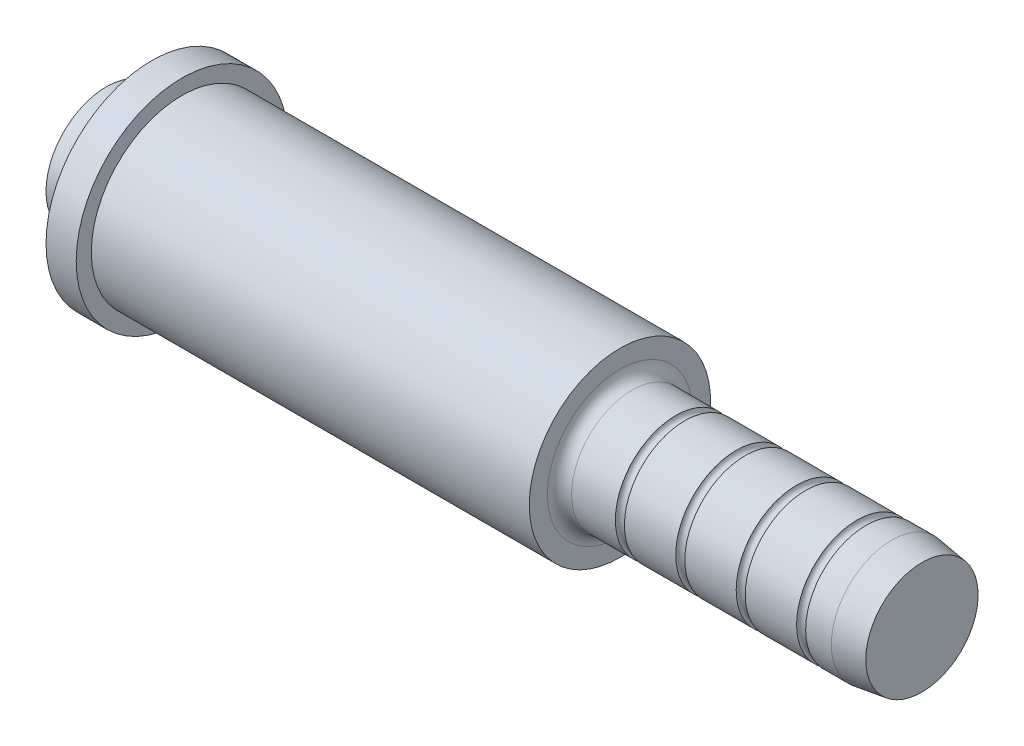
ISO-10303-21;
HEADER;
FILE_DESCRIPTION(('STEP AP214'),'2;1');
FILE_NAME('part.step','',(''),(''),'','','');
FILE_SCHEMA(('AUTOMOTIVE_DESIGN { 1 0 10303 214 1 1 1 1 }'));
ENDSEC;
DATA;
#1=APPLICATION_CONTEXT('core data for automotive mechanical design processes');
#2=APPLICATION_PROTOCOL_DEFINITION('international standard','automotive_design',2000,#1);
#3=PRODUCT_CONTEXT('',#1,'mechanical');
#4=PRODUCT('Part','Part','',(#3));
#5=PRODUCT_RELATED_PRODUCT_CATEGORY('part','',(#4));
#6=PRODUCT_DEFINITION_FORMATION('','',#4);
#7=PRODUCT_DEFINITION_CONTEXT('part definition',#1,'design');
#8=PRODUCT_DEFINITION('design','',#6,#7);
#9=PRODUCT_DEFINITION_SHAPE('','',#8);
#10=(LENGTH_UNIT() NAMED_UNIT(*) SI_UNIT(.MILLI.,.METRE.));
#11=(NAMED_UNIT(*) PLANE_ANGLE_UNIT() SI_UNIT($,.RADIAN.));
#12=(NAMED_UNIT(*) SI_UNIT($,.STERADIAN.) SOLID_ANGLE_UNIT());
#13=UNCERTAINTY_MEASURE_WITH_UNIT(LENGTH_MEASURE(1.E-05),#10,'distance_accuracy_value','');
#14=(GEOMETRIC_REPRESENTATION_CONTEXT(3) GLOBAL_UNCERTAINTY_ASSIGNED_CONTEXT((#13)) GLOBAL_UNIT_ASSIGNED_CONTEXT((#10,
#11,#12)) REPRESENTATION_CONTEXT('',''));
#15=CARTESIAN_POINT('',(0.,0.,0.));
#16=DIRECTION('',(0.,0.,1.));
#17=DIRECTION('',(1.,0.,0.));
#18=AXIS2_PLACEMENT_3D('',#15,#16,#17);
#19=CARTESIAN_POINT('',(0.,0.,0.));
#20=DIRECTION('',(1.,0.,0.));
#21=DIRECTION('',(0.,0.,-1.));
#22=AXIS2_PLACEMENT_3D('',#19,#20,#21);
#23=PLANE('',#22);
#24=CARTESIAN_POINT('',(0.,0.,0.));
#25=DIRECTION('',(-1.,0.,0.));
#26=DIRECTION('',(0.,0.,1.));
#27=AXIS2_PLACEMENT_3D('',#24,#25,#26);
#28=CIRCLE('',#27,20.);
#29=CARTESIAN_POINT('',(0.,0.,20.));
#30=VERTEX_POINT('',#29);
#31=EDGE_CURVE('E128',#30,#30,#28,.T.);
#32=ORIENTED_EDGE('',*,*,#31,.T.);
#33=EDGE_LOOP('',(#32));
#34=FACE_BOUND('',#33,.T.);
#35=ADVANCED_FACE('F33',(#34),#23,.F.);
#36=CARTESIAN_POINT('',(0.,0.,0.));
#37=DIRECTION('',(-1.,0.,0.));
#38=DIRECTION('',(0.,0.,1.));
#39=AXIS2_PLACEMENT_3D('',#36,#37,#38);
#40=CYLINDRICAL_SURFACE('',#39,20.);
#41=ORIENTED_EDGE('',*,*,#31,.F.);
#42=EDGE_LOOP('',(#41));
#43=FACE_BOUND('',#42,.T.);
#44=CARTESIAN_POINT('',(15.,0.,0.));
#45=DIRECTION('',(-1.,0.,0.));
#46=DIRECTION('',(0.,0.,1.));
#47=AXIS2_PLACEMENT_3D('',#44,#45,#46);
#48=CIRCLE('',#47,20.);
#49=CARTESIAN_POINT('',(15.,0.,20.));
#50=VERTEX_POINT('',#49);
#51=EDGE_CURVE('E130',#50,#50,#48,.T.);
#52=ORIENTED_EDGE('',*,*,#51,.T.);
#53=EDGE_LOOP('',(#52));
#54=FACE_BOUND('',#53,.T.);
#55=ADVANCED_FACE('F95',(#43,#54),#40,.T.);
#56=CARTESIAN_POINT('',(15.,20.,0.));
#57=DIRECTION('',(1.,0.,0.));
#58=DIRECTION('',(0.,0.,-1.));
#59=AXIS2_PLACEMENT_3D('',#56,#57,#58);
#60=PLANE('',#59);
#61=ORIENTED_EDGE('',*,*,#51,.F.);
#62=EDGE_LOOP('',(#61));
#63=FACE_BOUND('',#62,.T.);
#64=CARTESIAN_POINT('',(15.,0.,0.));
#65=DIRECTION('',(-1.,0.,0.));
#66=DIRECTION('',(0.,0.,1.));
#67=AXIS2_PLACEMENT_3D('',#64,#65,#66);
#68=CIRCLE('',#67,35.);
#69=CARTESIAN_POINT('',(15.,0.,35.));
#70=VERTEX_POINT('',#69);
#71=EDGE_CURVE('E135',#70,#70,#68,.T.);
#72=ORIENTED_EDGE('',*,*,#71,.T.);
#73=EDGE_LOOP('',(#72));
#74=FACE_BOUND('',#73,.T.);
#75=ADVANCED_FACE('F101',(#63,#74),#60,.F.);
#76=CARTESIAN_POINT('',(0.,0.,0.));
#77=DIRECTION('',(-1.,0.,0.));
#78=DIRECTION('',(0.,0.,1.));
#79=AXIS2_PLACEMENT_3D('',#76,#77,#78);
#80=CYLINDRICAL_SURFACE('',#79,35.);
#81=ORIENTED_EDGE('',*,*,#71,.F.);
#82=EDGE_LOOP('',(#81));
#83=FACE_BOUND('',#82,.T.);
#84=CARTESIAN_POINT('',(25.,0.,0.));
#85=DIRECTION('',(-1.,0.,0.));
#86=DIRECTION('',(0.,0.,1.));
#87=AXIS2_PLACEMENT_3D('',#84,#85,#86);
#88=CIRCLE('',#87,35.);
#89=CARTESIAN_POINT('',(25.,0.,35.));
#90=VERTEX_POINT('',#89);
#91=EDGE_CURVE('E138',#90,#90,#88,.T.);
#92=ORIENTED_EDGE('',*,*,#91,.T.);
#93=EDGE_LOOP('',(#92));
#94=FACE_BOUND('',#93,.T.);
#95=ADVANCED_FACE('F161',(#83,#94),#80,.T.);
#96=CARTESIAN_POINT('',(25.,35.,0.));
#97=DIRECTION('',(-1.,0.,0.));
#98=DIRECTION('',(0.,0.,1.));
#99=AXIS2_PLACEMENT_3D('',#96,#97,#98);
#100=PLANE('',#99);
#101=ORIENTED_EDGE('',*,*,#91,.F.);
#102=EDGE_LOOP('',(#101));
#103=FACE_BOUND('',#102,.T.);
#104=CARTESIAN_POINT('',(25.,0.,0.));
#105=DIRECTION('',(-1.,0.,0.));
#106=DIRECTION('',(0.,0.,1.));
#107=AXIS2_PLACEMENT_3D('',#104,#105,#106);
#108=CIRCLE('',#107,30.);
#109=CARTESIAN_POINT('',(25.,0.,30.));
#110=VERTEX_POINT('',#109);
#111=EDGE_CURVE('E141',#110,#110,#108,.T.);
#112=ORIENTED_EDGE('',*,*,#111,.T.);
#113=EDGE_LOOP('',(#112));
#114=FACE_BOUND('',#113,.T.);
#115=ADVANCED_FACE('F155',(#103,#114),#100,.F.);
#116=CARTESIAN_POINT('',(0.,0.,0.));
#117=DIRECTION('',(-1.,0.,0.));
#118=DIRECTION('',(0.,0.,1.));
#119=AXIS2_PLACEMENT_3D('',#116,#117,#118);
#120=CYLINDRICAL_SURFACE('',#119,30.);
#121=ORIENTED_EDGE('',*,*,#111,.F.);
#122=EDGE_LOOP('',(#121));
#123=FACE_BOUND('',#122,.T.);
#124=CARTESIAN_POINT('',(170.,0.,0.));
#125=DIRECTION('',(-1.,0.,0.));
#126=DIRECTION('',(0.,0.,1.));
#127=AXIS2_PLACEMENT_3D('',#124,#125,#126);
#128=CIRCLE('',#127,30.);
#129=CARTESIAN_POINT('',(170.,0.,30.));
#130=VERTEX_POINT('',#129);
#131=EDGE_CURVE('E57',#130,#130,#128,.T.);
#132=ORIENTED_EDGE('',*,*,#131,.T.);
#133=EDGE_LOOP('',(#132));
#134=FACE_BOUND('',#133,.T.);
#135=ADVANCED_FACE('F147',(#123,#134),#120,.T.);
#136=CARTESIAN_POINT('',(170.,30.,0.));
#137=DIRECTION('',(-1.,0.,0.));
#138=DIRECTION('',(0.,0.,1.));
#139=AXIS2_PLACEMENT_3D('',#136,#137,#138);
#140=PLANE('',#139);
#141=CARTESIAN_POINT('',(170.,0.,0.));
#142=DIRECTION('',(-1.,0.,0.));
#143=DIRECTION('',(0.,0.,1.));
#144=AXIS2_PLACEMENT_3D('',#141,#142,#143);
#145=CIRCLE('',#144,24.);
#146=CARTESIAN_POINT('',(170.,0.,24.));
#147=VERTEX_POINT('',#146);
#148=EDGE_CURVE('E126',#147,#147,#145,.T.);
#149=ORIENTED_EDGE('',*,*,#148,.T.);
#150=EDGE_LOOP('',(#149));
#151=FACE_BOUND('',#150,.T.);
#152=ORIENTED_EDGE('',*,*,#131,.F.);
#153=EDGE_LOOP('',(#152));
#154=FACE_BOUND('',#153,.T.);
#155=ADVANCED_FACE('F119',(#151,#154),#140,.F.);
#156=CARTESIAN_POINT('',(0.,0.,0.));
#157=DIRECTION('',(-1.,0.,0.));
#158=DIRECTION('',(0.,0.,1.));
#159=AXIS2_PLACEMENT_3D('',#156,#157,#158);
#160=CYLINDRICAL_SURFACE('',#159,20.);
#161=CARTESIAN_POINT('',(188.5,0.,0.));
#162=DIRECTION('',(1.,0.,0.));
#163=DIRECTION('',(0.,0.,-1.));
#164=AXIS2_PLACEMENT_3D('',#161,#162,#163);
#165=CIRCLE('',#164,20.);
#166=CARTESIAN_POINT('',(188.5,0.,-20.));
#167=VERTEX_POINT('',#166);
#168=EDGE_CURVE('E50',#167,#167,#165,.F.);
#169=ORIENTED_EDGE('',*,*,#168,.T.);
#170=EDGE_LOOP('',(#169));
#171=FACE_BOUND('',#170,.T.);
#172=CARTESIAN_POINT('',(174.,0.,0.));
#173=DIRECTION('',(-1.,0.,0.));
#174=DIRECTION('',(0.,0.,1.));
#175=AXIS2_PLACEMENT_3D('',#172,#173,#174);
#176=CIRCLE('',#175,20.);
#177=CARTESIAN_POINT('',(174.,0.,20.));
#178=VERTEX_POINT('',#177);
#179=EDGE_CURVE('E46',#178,#178,#176,.F.);
#180=ORIENTED_EDGE('',*,*,#179,.T.);
#181=EDGE_LOOP('',(#180));
#182=FACE_BOUND('',#181,.T.);
#183=ADVANCED_FACE('F109',(#171,#182),#160,.T.);
#184=CARTESIAN_POINT('',(174.,0.,0.));
#185=DIRECTION('',(-1.,0.,0.));
#186=DIRECTION('',(0.,0.,1.));
#187=AXIS2_PLACEMENT_3D('',#184,#185,#186);
#188=TOROIDAL_SURFACE('',#187,24.,4.);
#189=ORIENTED_EDGE('',*,*,#179,.F.);
#190=EDGE_LOOP('',(#189));
#191=FACE_BOUND('',#190,.T.);
#192=ORIENTED_EDGE('',*,*,#148,.F.);
#193=EDGE_LOOP('',(#192));
#194=FACE_BOUND('',#193,.T.);
#195=ADVANCED_FACE('F106',(#191,#194),#188,.F.);
#196=CARTESIAN_POINT('',(190.,0.,0.));
#197=DIRECTION('',(1.,0.,0.));
#198=DIRECTION('',(0.,0.,-1.));
#199=AXIS2_PLACEMENT_3D('',#196,#197,#198);
#200=TOROIDAL_SURFACE('',#199,20.,1.5);
#201=ORIENTED_EDGE('',*,*,#168,.F.);
#202=EDGE_LOOP('',(#201));
#203=FACE_BOUND('',#202,.T.);
#204=CARTESIAN_POINT('',(191.5,0.,0.));
#205=DIRECTION('',(-1.,0.,0.));
#206=DIRECTION('',(0.,0.,1.));
#207=AXIS2_PLACEMENT_3D('',#204,#205,#206);
#208=CIRCLE('',#207,20.);
#209=CARTESIAN_POINT('',(191.5,0.,20.));
#210=VERTEX_POINT('',#209);
#211=EDGE_CURVE('E53',#210,#210,#208,.F.);
#212=ORIENTED_EDGE('',*,*,#211,.F.);
#213=EDGE_LOOP('',(#212));
#214=FACE_BOUND('',#213,.T.);
#215=ADVANCED_FACE('F108',(#203,#214),#200,.F.);
#216=CARTESIAN_POINT('',(208.5,0.,0.));
#217=DIRECTION('',(1.,0.,0.));
#218=DIRECTION('',(0.,0.,-1.));
#219=AXIS2_PLACEMENT_3D('',#216,#217,#218);
#220=CIRCLE('',#219,20.);
#221=CARTESIAN_POINT('',(208.5,0.,-20.));
#222=VERTEX_POINT('',#221);
#223=EDGE_CURVE('E58',#222,#222,#220,.F.);
#224=ORIENTED_EDGE('',*,*,#223,.T.);
#225=EDGE_LOOP('',(#224));
#226=FACE_BOUND('',#225,.T.);
#227=ORIENTED_EDGE('',*,*,#211,.T.);
#228=EDGE_LOOP('',(#227));
#229=FACE_BOUND('',#228,.T.);
#230=ADVANCED_FACE('F115',(#226,#229),#160,.T.);
#231=CARTESIAN_POINT('',(210.,0.,0.));
#232=DIRECTION('',(1.,0.,0.));
#233=DIRECTION('',(0.,0.,-1.));
#234=AXIS2_PLACEMENT_3D('',#231,#232,#233);
#235=TOROIDAL_SURFACE('',#234,20.,1.5);
#236=ORIENTED_EDGE('',*,*,#223,.F.);
#237=EDGE_LOOP('',(#236));
#238=FACE_BOUND('',#237,.T.);
#239=CARTESIAN_POINT('',(211.5,0.,0.));
#240=DIRECTION('',(-1.,0.,0.));
#241=DIRECTION('',(0.,0.,1.));
#242=AXIS2_PLACEMENT_3D('',#239,#240,#241);
#243=CIRCLE('',#242,20.);
#244=CARTESIAN_POINT('',(211.5,0.,20.));
#245=VERTEX_POINT('',#244);
#246=EDGE_CURVE('E54',#245,#245,#243,.F.);
#247=ORIENTED_EDGE('',*,*,#246,.F.);
#248=EDGE_LOOP('',(#247));
#249=FACE_BOUND('',#248,.T.);
#250=ADVANCED_FACE('F234',(#238,#249),#235,.F.);
#251=CARTESIAN_POINT('',(228.5,0.,0.));
#252=DIRECTION('',(1.,0.,0.));
#253=DIRECTION('',(0.,0.,-1.));
#254=AXIS2_PLACEMENT_3D('',#251,#252,#253);
#255=CIRCLE('',#254,20.);
#256=CARTESIAN_POINT('',(228.5,0.,-20.));
#257=VERTEX_POINT('',#256);
#258=EDGE_CURVE('E64',#257,#257,#255,.F.);
#259=ORIENTED_EDGE('',*,*,#258,.T.);
#260=EDGE_LOOP('',(#259));
#261=FACE_BOUND('',#260,.T.);
#262=ORIENTED_EDGE('',*,*,#246,.T.);
#263=EDGE_LOOP('',(#262));
#264=FACE_BOUND('',#263,.T.);
#265=ADVANCED_FACE('F92',(#261,#264),#160,.T.);
#266=CARTESIAN_POINT('',(230.,0.,0.));
#267=DIRECTION('',(1.,0.,0.));
#268=DIRECTION('',(0.,0.,-1.));
#269=AXIS2_PLACEMENT_3D('',#266,#267,#268);
#270=TOROIDAL_SURFACE('',#269,20.,1.5);
#271=ORIENTED_EDGE('',*,*,#258,.F.);
#272=EDGE_LOOP('',(#271));
#273=FACE_BOUND('',#272,.T.);
#274=CARTESIAN_POINT('',(231.5,0.,0.));
#275=DIRECTION('',(-1.,0.,0.));
#276=DIRECTION('',(0.,0.,1.));
#277=AXIS2_PLACEMENT_3D('',#274,#275,#276);
#278=CIRCLE('',#277,20.);
#279=CARTESIAN_POINT('',(231.5,0.,20.));
#280=VERTEX_POINT('',#279);
#281=EDGE_CURVE('E61',#280,#280,#278,.F.);
#282=ORIENTED_EDGE('',*,*,#281,.F.);
#283=EDGE_LOOP('',(#282));
#284=FACE_BOUND('',#283,.T.);
#285=ADVANCED_FACE('F90',(#273,#284),#270,.F.);
#286=CARTESIAN_POINT('',(248.5,0.,0.));
#287=DIRECTION('',(1.,0.,0.));
#288=DIRECTION('',(0.,0.,-1.));
#289=AXIS2_PLACEMENT_3D('',#286,#287,#288);
#290=CIRCLE('',#289,20.);
#291=CARTESIAN_POINT('',(248.5,0.,-20.));
#292=VERTEX_POINT('',#291);
#293=EDGE_CURVE('E68',#292,#292,#290,.F.);
#294=ORIENTED_EDGE('',*,*,#293,.T.);
#295=EDGE_LOOP('',(#294));
#296=FACE_BOUND('',#295,.T.);
#297=ORIENTED_EDGE('',*,*,#281,.T.);
#298=EDGE_LOOP('',(#297));
#299=FACE_BOUND('',#298,.T.);
#300=ADVANCED_FACE('F81',(#296,#299),#160,.T.);
#301=CARTESIAN_POINT('',(250.,0.,0.));
#302=DIRECTION('',(1.,0.,0.));
#303=DIRECTION('',(0.,0.,-1.));
#304=AXIS2_PLACEMENT_3D('',#301,#302,#303);
#305=TOROIDAL_SURFACE('',#304,20.,1.5);
#306=ORIENTED_EDGE('',*,*,#293,.F.);
#307=EDGE_LOOP('',(#306));
#308=FACE_BOUND('',#307,.T.);
#309=CARTESIAN_POINT('',(251.5,0.,0.));
#310=DIRECTION('',(-1.,0.,0.));
#311=DIRECTION('',(0.,0.,1.));
#312=AXIS2_PLACEMENT_3D('',#309,#310,#311);
#313=CIRCLE('',#312,20.);
#314=CARTESIAN_POINT('',(251.5,0.,20.));
#315=VERTEX_POINT('',#314);
#316=EDGE_CURVE('E37',#315,#315,#313,.F.);
#317=ORIENTED_EDGE('',*,*,#316,.F.);
#318=EDGE_LOOP('',(#317));
#319=FACE_BOUND('',#318,.T.);
#320=ADVANCED_FACE('F78',(#308,#319),#305,.F.);
#321=CARTESIAN_POINT('',(270.,20.,0.));
#322=DIRECTION('',(-1.,0.,0.));
#323=DIRECTION('',(0.,0.,1.));
#324=AXIS2_PLACEMENT_3D('',#321,#322,#323);
#325=PLANE('',#324);
#326=CARTESIAN_POINT('',(270.,0.,0.));
#327=DIRECTION('',(-1.,0.,0.));
#328=DIRECTION('',(0.,0.,1.));
#329=AXIS2_PLACEMENT_3D('',#326,#327,#328);
#330=CIRCLE('',#329,18.5945916529761);
#331=CARTESIAN_POINT('',(270.,0.,18.5945916529761));
#332=VERTEX_POINT('',#331);
#333=EDGE_CURVE('E10',#332,#332,#330,.F.);
#334=ORIENTED_EDGE('',*,*,#333,.T.);
#335=EDGE_LOOP('',(#334));
#336=FACE_BOUND('',#335,.T.);
#337=ADVANCED_FACE('F80',(#336),#325,.F.);
#338=CARTESIAN_POINT('',(260.,0.,0.));
#339=DIRECTION('',(-1.,0.,0.));
#340=DIRECTION('',(0.,0.,1.));
#341=AXIS2_PLACEMENT_3D('',#338,#339,#340);
#342=CONICAL_SURFACE('',#341,20.,0.139626340159543);
#343=ORIENTED_EDGE('',*,*,#333,.F.);
#344=EDGE_LOOP('',(#343));
#345=FACE_BOUND('',#344,.T.);
#346=CARTESIAN_POINT('',(260.,0.,0.));
#347=DIRECTION('',(-1.,0.,0.));
#348=DIRECTION('',(0.,0.,1.));
#349=AXIS2_PLACEMENT_3D('',#346,#347,#348);
#350=CIRCLE('',#349,20.);
#351=CARTESIAN_POINT('',(260.,0.,20.));
#352=VERTEX_POINT('',#351);
#353=EDGE_CURVE('E41',#352,#352,#350,.T.);
#354=ORIENTED_EDGE('',*,*,#353,.F.);
#355=EDGE_LOOP('',(#354));
#356=FACE_BOUND('',#355,.T.);
#357=ADVANCED_FACE('F35',(#345,#356),#342,.T.);
#358=ORIENTED_EDGE('',*,*,#316,.T.);
#359=EDGE_LOOP('',(#358));
#360=FACE_BOUND('',#359,.T.);
#361=ORIENTED_EDGE('',*,*,#353,.T.);
#362=EDGE_LOOP('',(#361));
#363=FACE_BOUND('',#362,.T.);
#364=ADVANCED_FACE('F75',(#360,#363),#160,.T.);
#365=CLOSED_SHELL('',(#35,#55,#75,#95,#115,#135,#155,#183,#195,#215,#230,#250,#265,#285,#300,
#320,#337,#357,#364));
#366=MANIFOLD_SOLID_BREP('B2',#365);
#367=ADVANCED_BREP_SHAPE_REPRESENTATION('',(#18,#366),#14);
#368=SHAPE_DEFINITION_REPRESENTATION(#9,#367);
ENDSEC;
END-ISO-10303-21;
